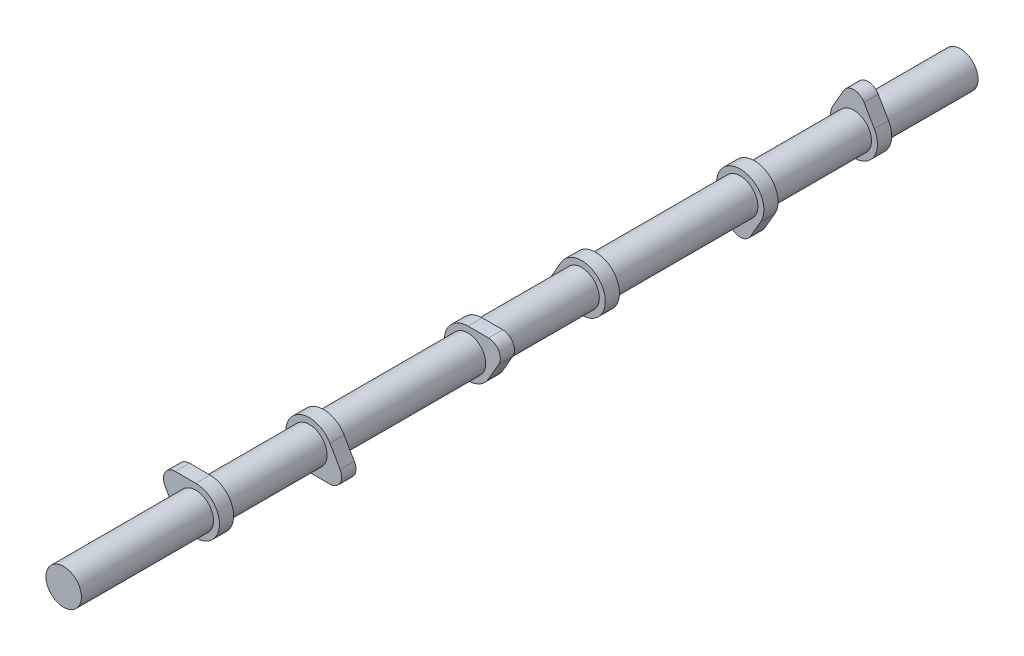
ISO-10303-21;
HEADER;
FILE_DESCRIPTION(('STEP AP214'),'2;1');
FILE_NAME('part.step','',(''),(''),'','','');
FILE_SCHEMA(('AUTOMOTIVE_DESIGN { 1 0 10303 214 1 1 1 1 }'));
ENDSEC;
DATA;
#1=APPLICATION_CONTEXT('core data for automotive mechanical design processes');
#2=APPLICATION_PROTOCOL_DEFINITION('international standard','automotive_design',2000,#1);
#3=PRODUCT_CONTEXT('',#1,'mechanical');
#4=PRODUCT('Part','Part','',(#3));
#5=PRODUCT_RELATED_PRODUCT_CATEGORY('part','',(#4));
#6=PRODUCT_DEFINITION_FORMATION('','',#4);
#7=PRODUCT_DEFINITION_CONTEXT('part definition',#1,'design');
#8=PRODUCT_DEFINITION('design','',#6,#7);
#9=PRODUCT_DEFINITION_SHAPE('','',#8);
#10=(LENGTH_UNIT() NAMED_UNIT(*) SI_UNIT(.MILLI.,.METRE.));
#11=(NAMED_UNIT(*) PLANE_ANGLE_UNIT() SI_UNIT($,.RADIAN.));
#12=(NAMED_UNIT(*) SI_UNIT($,.STERADIAN.) SOLID_ANGLE_UNIT());
#13=UNCERTAINTY_MEASURE_WITH_UNIT(LENGTH_MEASURE(1.E-05),#10,'distance_accuracy_value','');
#14=(GEOMETRIC_REPRESENTATION_CONTEXT(3) GLOBAL_UNCERTAINTY_ASSIGNED_CONTEXT((#13)) GLOBAL_UNIT_ASSIGNED_CONTEXT((#10,
#11,#12)) REPRESENTATION_CONTEXT('',''));
#15=CARTESIAN_POINT('',(0.,0.,0.));
#16=DIRECTION('',(0.,0.,1.));
#17=DIRECTION('',(1.,0.,0.));
#18=AXIS2_PLACEMENT_3D('',#15,#16,#17);
#19=CARTESIAN_POINT('',(0.,-12.7,64.77));
#20=DIRECTION('',(0.,0.,-1.));
#21=DIRECTION('',(1.,0.,0.));
#22=AXIS2_PLACEMENT_3D('',#19,#20,#21);
#23=CYLINDRICAL_SURFACE('',#22,6.35);
#24=CARTESIAN_POINT('',(0.,-12.7,57.15));
#25=DIRECTION('',(0.,0.,1.));
#26=DIRECTION('',(-1.,0.,0.));
#27=AXIS2_PLACEMENT_3D('',#24,#25,#26);
#28=CIRCLE('',#27,6.35);
#29=CARTESIAN_POINT('',(-5.49926131403129,-15.875,57.15));
#30=VERTEX_POINT('',#29);
#31=CARTESIAN_POINT('',(5.49926131403107,-15.875,57.15));
#32=VERTEX_POINT('',#31);
#33=EDGE_CURVE('E389',#30,#32,#28,.T.);
#34=ORIENTED_EDGE('',*,*,#33,.T.);
#35=DIRECTION('',(0.,0.,-1.));
#36=VECTOR('',#35,1.);
#37=CARTESIAN_POINT('',(5.49926131403107,-15.875,64.77));
#38=LINE('',#37,#36);
#39=CARTESIAN_POINT('',(5.49926131403107,-15.875,64.77));
#40=VERTEX_POINT('',#39);
#41=EDGE_CURVE('E408',#40,#32,#38,.T.);
#42=ORIENTED_EDGE('',*,*,#41,.F.);
#43=CARTESIAN_POINT('',(0.,-12.7,64.77));
#44=DIRECTION('',(0.,0.,1.));
#45=DIRECTION('',(-1.,0.,0.));
#46=AXIS2_PLACEMENT_3D('',#43,#44,#45);
#47=CIRCLE('',#46,6.35);
#48=CARTESIAN_POINT('',(-5.49926131403129,-15.875,64.77));
#49=VERTEX_POINT('',#48);
#50=EDGE_CURVE('E390',#49,#40,#47,.T.);
#51=ORIENTED_EDGE('',*,*,#50,.F.);
#52=DIRECTION('',(0.,0.,-1.));
#53=VECTOR('',#52,1.);
#54=CARTESIAN_POINT('',(-5.49926131403129,-15.875,64.77));
#55=LINE('',#54,#53);
#56=EDGE_CURVE('E396',#49,#30,#55,.T.);
#57=ORIENTED_EDGE('',*,*,#56,.T.);
#58=EDGE_LOOP('',(#34,#42,#51,#57));
#59=FACE_BOUND('',#58,.T.);
#60=ADVANCED_FACE('F37',(#59),#23,.T.);
#61=CARTESIAN_POINT('',(5.49926131403107,-15.875,64.77));
#62=DIRECTION('',(-0.866025403784435,0.500000000000006,0.));
#63=DIRECTION('',(-0.500000000000006,-0.866025403784435,0.));
#64=AXIS2_PLACEMENT_3D('',#61,#62,#63);
#65=PLANE('',#64);
#66=DIRECTION('',(0.500000000000006,0.866025403784435,0.));
#67=VECTOR('',#66,1.);
#68=CARTESIAN_POINT('',(5.49926131403107,-15.875,57.15));
#69=LINE('',#68,#67);
#70=CARTESIAN_POINT('',(10.9985226280623,-6.35000000000008,57.15));
#71=VERTEX_POINT('',#70);
#72=EDGE_CURVE('E399',#32,#71,#69,.T.);
#73=ORIENTED_EDGE('',*,*,#72,.T.);
#74=DIRECTION('',(0.,0.,-1.));
#75=VECTOR('',#74,1.);
#76=CARTESIAN_POINT('',(10.9985226280623,-6.35000000000008,64.77));
#77=LINE('',#76,#75);
#78=CARTESIAN_POINT('',(10.9985226280623,-6.35000000000008,64.77));
#79=VERTEX_POINT('',#78);
#80=EDGE_CURVE('E406',#79,#71,#77,.T.);
#81=ORIENTED_EDGE('',*,*,#80,.F.);
#82=DIRECTION('',(0.500000000000006,0.866025403784435,0.));
#83=VECTOR('',#82,1.);
#84=CARTESIAN_POINT('',(5.49926131403107,-15.875,64.77));
#85=LINE('',#84,#83);
#86=EDGE_CURVE('E86',#40,#79,#85,.T.);
#87=ORIENTED_EDGE('',*,*,#86,.F.);
#88=ORIENTED_EDGE('',*,*,#41,.T.);
#89=EDGE_LOOP('',(#73,#81,#87,#88));
#90=FACE_BOUND('',#89,.T.);
#91=ADVANCED_FACE('F427',(#90),#65,.F.);
#92=CARTESIAN_POINT('',(0.,0.,64.77));
#93=DIRECTION('',(0.,0.,-1.));
#94=DIRECTION('',(1.,0.,0.));
#95=AXIS2_PLACEMENT_3D('',#92,#93,#94);
#96=CYLINDRICAL_SURFACE('',#95,12.7);
#97=CARTESIAN_POINT('',(0.,0.,57.15));
#98=DIRECTION('',(0.,0.,1.));
#99=DIRECTION('',(-1.,0.,0.));
#100=AXIS2_PLACEMENT_3D('',#97,#98,#99);
#101=CIRCLE('',#100,12.7);
#102=CARTESIAN_POINT('',(-10.9985226280624,-6.34999999999993,57.15));
#103=VERTEX_POINT('',#102);
#104=EDGE_CURVE('E72',#71,#103,#101,.T.);
#105=ORIENTED_EDGE('',*,*,#104,.T.);
#106=DIRECTION('',(0.,0.,-1.));
#107=VECTOR('',#106,1.);
#108=CARTESIAN_POINT('',(-10.9985226280624,-6.34999999999993,64.77));
#109=LINE('',#108,#107);
#110=CARTESIAN_POINT('',(-10.9985226280624,-6.34999999999993,64.77));
#111=VERTEX_POINT('',#110);
#112=EDGE_CURVE('E404',#111,#103,#109,.T.);
#113=ORIENTED_EDGE('',*,*,#112,.F.);
#114=CARTESIAN_POINT('',(0.,0.,64.77));
#115=DIRECTION('',(0.,0.,1.));
#116=DIRECTION('',(-1.,0.,0.));
#117=AXIS2_PLACEMENT_3D('',#114,#115,#116);
#118=CIRCLE('',#117,12.7);
#119=EDGE_CURVE('E393',#79,#111,#118,.T.);
#120=ORIENTED_EDGE('',*,*,#119,.F.);
#121=ORIENTED_EDGE('',*,*,#80,.T.);
#122=EDGE_LOOP('',(#105,#113,#120,#121));
#123=FACE_BOUND('',#122,.T.);
#124=ADVANCED_FACE('F426',(#123),#96,.T.);
#125=CARTESIAN_POINT('',(-5.49926131403129,-15.875,64.77));
#126=DIRECTION('',(0.866025403784442,0.499999999999994,0.));
#127=DIRECTION('',(-0.499999999999994,0.866025403784442,0.));
#128=AXIS2_PLACEMENT_3D('',#125,#126,#127);
#129=PLANE('',#128);
#130=DIRECTION('',(0.499999999999994,-0.866025403784442,0.));
#131=VECTOR('',#130,1.);
#132=CARTESIAN_POINT('',(-5.49926131403129,-15.875,57.15));
#133=LINE('',#132,#131);
#134=EDGE_CURVE('E78',#103,#30,#133,.T.);
#135=ORIENTED_EDGE('',*,*,#134,.T.);
#136=ORIENTED_EDGE('',*,*,#56,.F.);
#137=DIRECTION('',(0.499999999999994,-0.866025403784442,0.));
#138=VECTOR('',#137,1.);
#139=CARTESIAN_POINT('',(-5.49926131403129,-15.875,64.77));
#140=LINE('',#139,#138);
#141=EDGE_CURVE('E54',#111,#49,#140,.T.);
#142=ORIENTED_EDGE('',*,*,#141,.F.);
#143=ORIENTED_EDGE('',*,*,#112,.T.);
#144=EDGE_LOOP('',(#135,#136,#142,#143));
#145=FACE_BOUND('',#144,.T.);
#146=ADVANCED_FACE('F424',(#145),#129,.F.);
#147=CARTESIAN_POINT('',(0.,-12.7,64.77));
#148=DIRECTION('',(0.,0.,1.));
#149=DIRECTION('',(-1.,0.,0.));
#150=AXIS2_PLACEMENT_3D('',#147,#148,#149);
#151=PLANE('',#150);
#152=CARTESIAN_POINT('',(0.,0.,64.77));
#153=DIRECTION('',(0.,0.,1.));
#154=DIRECTION('',(1.,0.,0.));
#155=AXIS2_PLACEMENT_3D('',#152,#153,#154);
#156=CIRCLE('',#155,9.5);
#157=CARTESIAN_POINT('',(9.5,0.,64.77));
#158=VERTEX_POINT('',#157);
#159=EDGE_CURVE('E386',#158,#158,#156,.F.);
#160=ORIENTED_EDGE('',*,*,#159,.T.);
#161=EDGE_LOOP('',(#160));
#162=FACE_BOUND('',#161,.T.);
#163=ORIENTED_EDGE('',*,*,#50,.T.);
#164=ORIENTED_EDGE('',*,*,#86,.T.);
#165=ORIENTED_EDGE('',*,*,#119,.T.);
#166=ORIENTED_EDGE('',*,*,#141,.T.);
#167=EDGE_LOOP('',(#163,#164,#165,#166));
#168=FACE_BOUND('',#167,.T.);
#169=ADVANCED_FACE('F418',(#162,#168),#151,.T.);
#170=CARTESIAN_POINT('',(0.,-12.7,57.15));
#171=DIRECTION('',(0.,0.,1.));
#172=DIRECTION('',(-1.,0.,0.));
#173=AXIS2_PLACEMENT_3D('',#170,#171,#172);
#174=PLANE('',#173);
#175=CARTESIAN_POINT('',(0.,0.,57.15));
#176=DIRECTION('',(0.,0.,1.));
#177=DIRECTION('',(1.,0.,0.));
#178=AXIS2_PLACEMENT_3D('',#175,#176,#177);
#179=CIRCLE('',#178,9.5);
#180=CARTESIAN_POINT('',(9.5,0.,57.15));
#181=VERTEX_POINT('',#180);
#182=EDGE_CURVE('E46',#181,#181,#179,.F.);
#183=ORIENTED_EDGE('',*,*,#182,.F.);
#184=EDGE_LOOP('',(#183));
#185=FACE_BOUND('',#184,.T.);
#186=ORIENTED_EDGE('',*,*,#33,.F.);
#187=ORIENTED_EDGE('',*,*,#134,.F.);
#188=ORIENTED_EDGE('',*,*,#104,.F.);
#189=ORIENTED_EDGE('',*,*,#72,.F.);
#190=EDGE_LOOP('',(#186,#187,#188,#189));
#191=FACE_BOUND('',#190,.T.);
#192=ADVANCED_FACE('F415',(#185,#191),#174,.F.);
#193=CARTESIAN_POINT('',(0.,0.,120.65));
#194=DIRECTION('',(0.,0.,-1.));
#195=DIRECTION('',(-1.,0.,0.));
#196=AXIS2_PLACEMENT_3D('',#193,#194,#195);
#197=CYLINDRICAL_SURFACE('',#196,9.5);
#198=CARTESIAN_POINT('',(0.,0.,3.80999999999999));
#199=DIRECTION('',(0.,0.,1.));
#200=DIRECTION('',(1.,0.,0.));
#201=AXIS2_PLACEMENT_3D('',#198,#199,#200);
#202=CIRCLE('',#201,9.5);
#203=CARTESIAN_POINT('',(9.5,0.,3.80999999999999));
#204=VERTEX_POINT('',#203);
#205=EDGE_CURVE('E40',#204,#204,#202,.T.);
#206=ORIENTED_EDGE('',*,*,#205,.T.);
#207=EDGE_LOOP('',(#206));
#208=FACE_BOUND('',#207,.T.);
#209=ORIENTED_EDGE('',*,*,#182,.T.);
#210=EDGE_LOOP('',(#209));
#211=FACE_BOUND('',#210,.T.);
#212=ADVANCED_FACE('F413',(#208,#211),#197,.T.);
#213=ORIENTED_EDGE('',*,*,#159,.F.);
#214=EDGE_LOOP('',(#213));
#215=FACE_BOUND('',#214,.T.);
#216=CARTESIAN_POINT('',(0.,0.,142.24));
#217=DIRECTION('',(0.,0.,1.));
#218=DIRECTION('',(-0.500000000000004,0.866025403784436,0.));
#219=AXIS2_PLACEMENT_3D('',#216,#217,#218);
#220=CIRCLE('',#219,9.5);
#221=CARTESIAN_POINT('',(-4.75000000000004,8.22724133595215,142.24));
#222=VERTEX_POINT('',#221);
#223=EDGE_CURVE('E348',#222,#222,#220,.T.);
#224=ORIENTED_EDGE('',*,*,#223,.F.);
#225=EDGE_LOOP('',(#224));
#226=FACE_BOUND('',#225,.T.);
#227=ADVANCED_FACE('F440',(#215,#226),#197,.T.);
#228=CARTESIAN_POINT('',(0.,12.7,3.81));
#229=DIRECTION('',(0.,0.,-1.));
#230=DIRECTION('',(-1.,0.,0.));
#231=AXIS2_PLACEMENT_3D('',#228,#229,#230);
#232=CYLINDRICAL_SURFACE('',#231,6.35);
#233=CARTESIAN_POINT('',(0.,12.7,-3.81));
#234=DIRECTION('',(0.,0.,1.));
#235=DIRECTION('',(1.,0.,0.));
#236=AXIS2_PLACEMENT_3D('',#233,#234,#235);
#237=CIRCLE('',#236,6.35);
#238=CARTESIAN_POINT('',(5.49926131403118,15.875,-3.81));
#239=VERTEX_POINT('',#238);
#240=CARTESIAN_POINT('',(-5.49926131403118,15.875,-3.81));
#241=VERTEX_POINT('',#240);
#242=EDGE_CURVE('E356',#239,#241,#237,.T.);
#243=ORIENTED_EDGE('',*,*,#242,.T.);
#244=DIRECTION('',(0.,0.,-1.));
#245=VECTOR('',#244,1.);
#246=CARTESIAN_POINT('',(-5.49926131403118,15.875,3.81));
#247=LINE('',#246,#245);
#248=CARTESIAN_POINT('',(-5.49926131403118,15.875,3.81));
#249=VERTEX_POINT('',#248);
#250=EDGE_CURVE('E383',#249,#241,#247,.T.);
#251=ORIENTED_EDGE('',*,*,#250,.F.);
#252=CARTESIAN_POINT('',(0.,12.7,3.81));
#253=DIRECTION('',(0.,0.,1.));
#254=DIRECTION('',(1.,0.,0.));
#255=AXIS2_PLACEMENT_3D('',#252,#253,#254);
#256=CIRCLE('',#255,6.35);
#257=CARTESIAN_POINT('',(5.49926131403118,15.875,3.81));
#258=VERTEX_POINT('',#257);
#259=EDGE_CURVE('E357',#258,#249,#256,.T.);
#260=ORIENTED_EDGE('',*,*,#259,.F.);
#261=DIRECTION('',(0.,0.,-1.));
#262=VECTOR('',#261,1.);
#263=CARTESIAN_POINT('',(5.49926131403118,15.875,3.81));
#264=LINE('',#263,#262);
#265=EDGE_CURVE('E367',#258,#239,#264,.T.);
#266=ORIENTED_EDGE('',*,*,#265,.T.);
#267=EDGE_LOOP('',(#243,#251,#260,#266));
#268=FACE_BOUND('',#267,.T.);
#269=ADVANCED_FACE('F443',(#268),#232,.T.);
#270=CARTESIAN_POINT('',(-5.49926131403118,15.875,3.81));
#271=DIRECTION('',(0.866025403784439,-0.5,0.));
#272=DIRECTION('',(0.5,0.866025403784439,0.));
#273=AXIS2_PLACEMENT_3D('',#270,#271,#272);
#274=PLANE('',#273);
#275=DIRECTION('',(-0.5,-0.866025403784439,0.));
#276=VECTOR('',#275,1.);
#277=CARTESIAN_POINT('',(-5.49926131403118,15.875,-3.81));
#278=LINE('',#277,#276);
#279=CARTESIAN_POINT('',(-10.9985226280624,6.35,-3.81));
#280=VERTEX_POINT('',#279);
#281=EDGE_CURVE('E370',#241,#280,#278,.T.);
#282=ORIENTED_EDGE('',*,*,#281,.T.);
#283=DIRECTION('',(0.,0.,-1.));
#284=VECTOR('',#283,1.);
#285=CARTESIAN_POINT('',(-10.9985226280624,6.35,3.81));
#286=LINE('',#285,#284);
#287=CARTESIAN_POINT('',(-10.9985226280624,6.35,3.81));
#288=VERTEX_POINT('',#287);
#289=EDGE_CURVE('E380',#288,#280,#286,.T.);
#290=ORIENTED_EDGE('',*,*,#289,.F.);
#291=DIRECTION('',(-0.5,-0.866025403784439,0.));
#292=VECTOR('',#291,1.);
#293=CARTESIAN_POINT('',(-5.49926131403118,15.875,3.81));
#294=LINE('',#293,#292);
#295=EDGE_CURVE('E360',#249,#288,#294,.T.);
#296=ORIENTED_EDGE('',*,*,#295,.F.);
#297=ORIENTED_EDGE('',*,*,#250,.T.);
#298=EDGE_LOOP('',(#282,#290,#296,#297));
#299=FACE_BOUND('',#298,.T.);
#300=ADVANCED_FACE('F448',(#299),#274,.F.);
#301=CARTESIAN_POINT('',(0.,0.,3.81));
#302=DIRECTION('',(0.,0.,-1.));
#303=DIRECTION('',(-1.,0.,0.));
#304=AXIS2_PLACEMENT_3D('',#301,#302,#303);
#305=CYLINDRICAL_SURFACE('',#304,12.7);
#306=CARTESIAN_POINT('',(0.,0.,-3.81));
#307=DIRECTION('',(0.,0.,1.));
#308=DIRECTION('',(1.,0.,0.));
#309=AXIS2_PLACEMENT_3D('',#306,#307,#308);
#310=CIRCLE('',#309,12.7);
#311=CARTESIAN_POINT('',(10.9985226280624,6.35,-3.81));
#312=VERTEX_POINT('',#311);
#313=EDGE_CURVE('E372',#280,#312,#310,.T.);
#314=ORIENTED_EDGE('',*,*,#313,.T.);
#315=DIRECTION('',(0.,0.,-1.));
#316=VECTOR('',#315,1.);
#317=CARTESIAN_POINT('',(10.9985226280624,6.35,3.81));
#318=LINE('',#317,#316);
#319=CARTESIAN_POINT('',(10.9985226280624,6.35,3.81));
#320=VERTEX_POINT('',#319);
#321=EDGE_CURVE('E377',#320,#312,#318,.T.);
#322=ORIENTED_EDGE('',*,*,#321,.F.);
#323=CARTESIAN_POINT('',(0.,0.,3.81));
#324=DIRECTION('',(0.,0.,1.));
#325=DIRECTION('',(1.,0.,0.));
#326=AXIS2_PLACEMENT_3D('',#323,#324,#325);
#327=CIRCLE('',#326,12.7);
#328=EDGE_CURVE('E363',#288,#320,#327,.T.);
#329=ORIENTED_EDGE('',*,*,#328,.F.);
#330=ORIENTED_EDGE('',*,*,#289,.T.);
#331=EDGE_LOOP('',(#314,#322,#329,#330));
#332=FACE_BOUND('',#331,.T.);
#333=ADVANCED_FACE('F452',(#332),#305,.T.);
#334=CARTESIAN_POINT('',(5.49926131403118,15.875,3.81));
#335=DIRECTION('',(-0.866025403784438,-0.5,0.));
#336=DIRECTION('',(0.5,-0.866025403784439,0.));
#337=AXIS2_PLACEMENT_3D('',#334,#335,#336);
#338=PLANE('',#337);
#339=DIRECTION('',(-0.5,0.866025403784439,0.));
#340=VECTOR('',#339,1.);
#341=CARTESIAN_POINT('',(5.49926131403118,15.875,-3.81));
#342=LINE('',#341,#340);
#343=EDGE_CURVE('E361',#312,#239,#342,.T.);
#344=ORIENTED_EDGE('',*,*,#343,.T.);
#345=ORIENTED_EDGE('',*,*,#265,.F.);
#346=DIRECTION('',(-0.5,0.866025403784439,0.));
#347=VECTOR('',#346,1.);
#348=CARTESIAN_POINT('',(5.49926131403118,15.875,3.81));
#349=LINE('',#348,#347);
#350=EDGE_CURVE('E365',#320,#258,#349,.T.);
#351=ORIENTED_EDGE('',*,*,#350,.F.);
#352=ORIENTED_EDGE('',*,*,#321,.T.);
#353=EDGE_LOOP('',(#344,#345,#351,#352));
#354=FACE_BOUND('',#353,.T.);
#355=ADVANCED_FACE('F456',(#354),#338,.F.);
#356=CARTESIAN_POINT('',(0.,12.7,3.81));
#357=DIRECTION('',(0.,0.,1.));
#358=DIRECTION('',(1.,0.,0.));
#359=AXIS2_PLACEMENT_3D('',#356,#357,#358);
#360=PLANE('',#359);
#361=ORIENTED_EDGE('',*,*,#205,.F.);
#362=EDGE_LOOP('',(#361));
#363=FACE_BOUND('',#362,.T.);
#364=ORIENTED_EDGE('',*,*,#259,.T.);
#365=ORIENTED_EDGE('',*,*,#295,.T.);
#366=ORIENTED_EDGE('',*,*,#328,.T.);
#367=ORIENTED_EDGE('',*,*,#350,.T.);
#368=EDGE_LOOP('',(#364,#365,#366,#367));
#369=FACE_BOUND('',#368,.T.);
#370=ADVANCED_FACE('F460',(#363,#369),#360,.T.);
#371=CARTESIAN_POINT('',(0.,12.7,-3.81));
#372=DIRECTION('',(0.,0.,1.));
#373=DIRECTION('',(1.,0.,0.));
#374=AXIS2_PLACEMENT_3D('',#371,#372,#373);
#375=PLANE('',#374);
#376=CARTESIAN_POINT('',(0.,0.,-3.80999999999999));
#377=DIRECTION('',(0.,0.,1.));
#378=DIRECTION('',(1.,0.,0.));
#379=AXIS2_PLACEMENT_3D('',#376,#377,#378);
#380=CIRCLE('',#379,9.5);
#381=CARTESIAN_POINT('',(9.5,0.,-3.80999999999999));
#382=VERTEX_POINT('',#381);
#383=EDGE_CURVE('E11',#382,#382,#380,.T.);
#384=ORIENTED_EDGE('',*,*,#383,.T.);
#385=EDGE_LOOP('',(#384));
#386=FACE_BOUND('',#385,.T.);
#387=ORIENTED_EDGE('',*,*,#242,.F.);
#388=ORIENTED_EDGE('',*,*,#343,.F.);
#389=ORIENTED_EDGE('',*,*,#313,.F.);
#390=ORIENTED_EDGE('',*,*,#281,.F.);
#391=EDGE_LOOP('',(#387,#388,#389,#390));
#392=FACE_BOUND('',#391,.T.);
#393=ADVANCED_FACE('F462',(#386,#392),#375,.F.);
#394=ORIENTED_EDGE('',*,*,#383,.F.);
#395=EDGE_LOOP('',(#394));
#396=FACE_BOUND('',#395,.T.);
#397=CARTESIAN_POINT('',(0.,0.,-53.34));
#398=DIRECTION('',(0.,0.,-1.));
#399=DIRECTION('',(-1.,0.,0.));
#400=AXIS2_PLACEMENT_3D('',#397,#398,#399);
#401=CIRCLE('',#400,9.5);
#402=CARTESIAN_POINT('',(-9.5,0.,-53.34));
#403=VERTEX_POINT('',#402);
#404=EDGE_CURVE('E351',#403,#403,#401,.T.);
#405=ORIENTED_EDGE('',*,*,#404,.F.);
#406=EDGE_LOOP('',(#405));
#407=FACE_BOUND('',#406,.T.);
#408=ADVANCED_FACE('F445',(#396,#407),#197,.T.);
#409=CARTESIAN_POINT('',(0.,0.,-53.34));
#410=DIRECTION('',(0.,0.,-1.));
#411=DIRECTION('',(-1.,0.,0.));
#412=AXIS2_PLACEMENT_3D('',#409,#410,#411);
#413=PLANE('',#412);
#414=ORIENTED_EDGE('',*,*,#404,.T.);
#415=EDGE_LOOP('',(#414));
#416=FACE_BOUND('',#415,.T.);
#417=ADVANCED_FACE('F469',(#416),#413,.T.);
#418=CARTESIAN_POINT('',(10.9985226280624,6.34999999999998,210.82));
#419=DIRECTION('',(0.,0.,-1.));
#420=DIRECTION('',(-0.499999999999998,0.86602540378444,0.));
#421=AXIS2_PLACEMENT_3D('',#418,#419,#420);
#422=CYLINDRICAL_SURFACE('',#421,6.35);
#423=CARTESIAN_POINT('',(10.9985226280624,6.34999999999998,203.2));
#424=DIRECTION('',(0.,0.,1.));
#425=DIRECTION('',(0.499999999999998,-0.86602540378444,0.));
#426=AXIS2_PLACEMENT_3D('',#423,#424,#425);
#427=CIRCLE('',#426,6.35);
#428=CARTESIAN_POINT('',(16.4977839420936,3.17499999999996,203.2));
#429=VERTEX_POINT('',#428);
#430=CARTESIAN_POINT('',(10.9985226280624,12.7,203.2));
#431=VERTEX_POINT('',#430);
#432=EDGE_CURVE('E315',#429,#431,#427,.T.);
#433=ORIENTED_EDGE('',*,*,#432,.T.);
#434=DIRECTION('',(0.,0.,-1.));
#435=VECTOR('',#434,1.);
#436=CARTESIAN_POINT('',(10.9985226280624,12.7,210.82));
#437=LINE('',#436,#435);
#438=CARTESIAN_POINT('',(10.9985226280624,12.7,210.82));
#439=VERTEX_POINT('',#438);
#440=EDGE_CURVE('E342',#439,#431,#437,.T.);
#441=ORIENTED_EDGE('',*,*,#440,.F.);
#442=CARTESIAN_POINT('',(10.9985226280624,6.34999999999998,210.82));
#443=DIRECTION('',(0.,0.,1.));
#444=DIRECTION('',(0.499999999999998,-0.86602540378444,0.));
#445=AXIS2_PLACEMENT_3D('',#442,#443,#444);
#446=CIRCLE('',#445,6.35);
#447=CARTESIAN_POINT('',(16.4977839420936,3.17499999999996,210.82));
#448=VERTEX_POINT('',#447);
#449=EDGE_CURVE('E316',#448,#439,#446,.T.);
#450=ORIENTED_EDGE('',*,*,#449,.F.);
#451=DIRECTION('',(0.,0.,-1.));
#452=VECTOR('',#451,1.);
#453=CARTESIAN_POINT('',(16.4977839420936,3.17499999999996,210.82));
#454=LINE('',#453,#452);
#455=EDGE_CURVE('E326',#448,#429,#454,.T.);
#456=ORIENTED_EDGE('',*,*,#455,.T.);
#457=EDGE_LOOP('',(#433,#441,#450,#456));
#458=FACE_BOUND('',#457,.T.);
#459=ADVANCED_FACE('F472',(#458),#422,.T.);
#460=CARTESIAN_POINT('',(10.9985226280624,12.7,210.82));
#461=DIRECTION('',(0.,-1.,0.));
#462=DIRECTION('',(1.,0.,0.));
#463=AXIS2_PLACEMENT_3D('',#460,#461,#462);
#464=PLANE('',#463);
#465=DIRECTION('',(-1.,0.,0.));
#466=VECTOR('',#465,1.);
#467=CARTESIAN_POINT('',(10.9985226280624,12.7,203.2));
#468=LINE('',#467,#466);
#469=CARTESIAN_POINT('',(0.,12.7,203.2));
#470=VERTEX_POINT('',#469);
#471=EDGE_CURVE('E329',#431,#470,#468,.T.);
#472=ORIENTED_EDGE('',*,*,#471,.T.);
#473=DIRECTION('',(0.,0.,-1.));
#474=VECTOR('',#473,1.);
#475=CARTESIAN_POINT('',(0.,12.7,210.82));
#476=LINE('',#475,#474);
#477=CARTESIAN_POINT('',(0.,12.7,210.82));
#478=VERTEX_POINT('',#477);
#479=EDGE_CURVE('E339',#478,#470,#476,.T.);
#480=ORIENTED_EDGE('',*,*,#479,.F.);
#481=DIRECTION('',(-1.,0.,0.));
#482=VECTOR('',#481,1.);
#483=CARTESIAN_POINT('',(10.9985226280624,12.7,210.82));
#484=LINE('',#483,#482);
#485=EDGE_CURVE('E319',#439,#478,#484,.T.);
#486=ORIENTED_EDGE('',*,*,#485,.F.);
#487=ORIENTED_EDGE('',*,*,#440,.T.);
#488=EDGE_LOOP('',(#472,#480,#486,#487));
#489=FACE_BOUND('',#488,.T.);
#490=ADVANCED_FACE('F476',(#489),#464,.F.);
#491=CARTESIAN_POINT('',(0.,0.,210.82));
#492=DIRECTION('',(0.,0.,-1.));
#493=DIRECTION('',(-0.499999999999998,0.86602540378444,0.));
#494=AXIS2_PLACEMENT_3D('',#491,#492,#493);
#495=CYLINDRICAL_SURFACE('',#494,12.7);
#496=CARTESIAN_POINT('',(0.,0.,203.2));
#497=DIRECTION('',(0.,0.,1.));
#498=DIRECTION('',(0.499999999999998,-0.86602540378444,0.));
#499=AXIS2_PLACEMENT_3D('',#496,#497,#498);
#500=CIRCLE('',#499,12.7);
#501=CARTESIAN_POINT('',(10.9985226280624,-6.35000000000002,203.2));
#502=VERTEX_POINT('',#501);
#503=EDGE_CURVE('E331',#470,#502,#500,.T.);
#504=ORIENTED_EDGE('',*,*,#503,.T.);
#505=DIRECTION('',(0.,0.,-1.));
#506=VECTOR('',#505,1.);
#507=CARTESIAN_POINT('',(10.9985226280624,-6.35000000000002,210.82));
#508=LINE('',#507,#506);
#509=CARTESIAN_POINT('',(10.9985226280624,-6.35000000000002,210.82));
#510=VERTEX_POINT('',#509);
#511=EDGE_CURVE('E336',#510,#502,#508,.T.);
#512=ORIENTED_EDGE('',*,*,#511,.F.);
#513=CARTESIAN_POINT('',(0.,0.,210.82));
#514=DIRECTION('',(0.,0.,1.));
#515=DIRECTION('',(0.499999999999998,-0.86602540378444,0.));
#516=AXIS2_PLACEMENT_3D('',#513,#514,#515);
#517=CIRCLE('',#516,12.7);
#518=EDGE_CURVE('E322',#478,#510,#517,.T.);
#519=ORIENTED_EDGE('',*,*,#518,.F.);
#520=ORIENTED_EDGE('',*,*,#479,.T.);
#521=EDGE_LOOP('',(#504,#512,#519,#520));
#522=FACE_BOUND('',#521,.T.);
#523=ADVANCED_FACE('F480',(#522),#495,.T.);
#524=CARTESIAN_POINT('',(16.4977839420936,3.17499999999996,210.82));
#525=DIRECTION('',(-0.866025403784438,0.500000000000002,0.));
#526=DIRECTION('',(-0.500000000000002,-0.866025403784438,0.));
#527=AXIS2_PLACEMENT_3D('',#524,#525,#526);
#528=PLANE('',#527);
#529=DIRECTION('',(0.500000000000002,0.866025403784438,0.));
#530=VECTOR('',#529,1.);
#531=CARTESIAN_POINT('',(16.4977839420936,3.17499999999996,203.2));
#532=LINE('',#531,#530);
#533=EDGE_CURVE('E320',#502,#429,#532,.T.);
#534=ORIENTED_EDGE('',*,*,#533,.T.);
#535=ORIENTED_EDGE('',*,*,#455,.F.);
#536=DIRECTION('',(0.500000000000002,0.866025403784438,0.));
#537=VECTOR('',#536,1.);
#538=CARTESIAN_POINT('',(16.4977839420936,3.17499999999996,210.82));
#539=LINE('',#538,#537);
#540=EDGE_CURVE('E324',#510,#448,#539,.T.);
#541=ORIENTED_EDGE('',*,*,#540,.F.);
#542=ORIENTED_EDGE('',*,*,#511,.T.);
#543=EDGE_LOOP('',(#534,#535,#541,#542));
#544=FACE_BOUND('',#543,.T.);
#545=ADVANCED_FACE('F484',(#544),#528,.F.);
#546=CARTESIAN_POINT('',(10.9985226280624,6.34999999999998,210.82));
#547=DIRECTION('',(0.,0.,1.));
#548=DIRECTION('',(0.499999999999998,-0.86602540378444,0.));
#549=AXIS2_PLACEMENT_3D('',#546,#547,#548);
#550=PLANE('',#549);
#551=CARTESIAN_POINT('',(0.,0.,210.82));
#552=DIRECTION('',(0.,0.,1.));
#553=DIRECTION('',(-0.500000000000004,0.866025403784436,0.));
#554=AXIS2_PLACEMENT_3D('',#551,#552,#553);
#555=CIRCLE('',#554,9.5);
#556=CARTESIAN_POINT('',(-4.75000000000004,8.22724133595215,210.82));
#557=VERTEX_POINT('',#556);
#558=EDGE_CURVE('E312',#557,#557,#555,.F.);
#559=ORIENTED_EDGE('',*,*,#558,.T.);
#560=EDGE_LOOP('',(#559));
#561=FACE_BOUND('',#560,.T.);
#562=ORIENTED_EDGE('',*,*,#449,.T.);
#563=ORIENTED_EDGE('',*,*,#485,.T.);
#564=ORIENTED_EDGE('',*,*,#518,.T.);
#565=ORIENTED_EDGE('',*,*,#540,.T.);
#566=EDGE_LOOP('',(#562,#563,#564,#565));
#567=FACE_BOUND('',#566,.T.);
#568=ADVANCED_FACE('F488',(#561,#567),#550,.T.);
#569=CARTESIAN_POINT('',(10.9985226280624,6.34999999999998,203.2));
#570=DIRECTION('',(0.,0.,1.));
#571=DIRECTION('',(0.499999999999998,-0.86602540378444,0.));
#572=AXIS2_PLACEMENT_3D('',#569,#570,#571);
#573=PLANE('',#572);
#574=CARTESIAN_POINT('',(0.,0.,203.2));
#575=DIRECTION('',(0.,0.,1.));
#576=DIRECTION('',(-0.500000000000004,0.866025403784436,0.));
#577=AXIS2_PLACEMENT_3D('',#574,#575,#576);
#578=CIRCLE('',#577,9.5);
#579=CARTESIAN_POINT('',(-4.75000000000004,8.22724133595215,203.2));
#580=VERTEX_POINT('',#579);
#581=EDGE_CURVE('E345',#580,#580,#578,.F.);
#582=ORIENTED_EDGE('',*,*,#581,.F.);
#583=EDGE_LOOP('',(#582));
#584=FACE_BOUND('',#583,.T.);
#585=ORIENTED_EDGE('',*,*,#432,.F.);
#586=ORIENTED_EDGE('',*,*,#533,.F.);
#587=ORIENTED_EDGE('',*,*,#503,.F.);
#588=ORIENTED_EDGE('',*,*,#471,.F.);
#589=EDGE_LOOP('',(#585,#586,#587,#588));
#590=FACE_BOUND('',#589,.T.);
#591=ADVANCED_FACE('F490',(#584,#590),#573,.F.);
#592=CARTESIAN_POINT('',(0.,0.,266.7));
#593=DIRECTION('',(0.,0.,-1.));
#594=DIRECTION('',(0.500000000000004,-0.866025403784436,0.));
#595=AXIS2_PLACEMENT_3D('',#592,#593,#594);
#596=CYLINDRICAL_SURFACE('',#595,9.5);
#597=CARTESIAN_POINT('',(0.,0.,149.86));
#598=DIRECTION('',(0.,0.,1.));
#599=DIRECTION('',(-0.500000000000004,0.866025403784436,0.));
#600=AXIS2_PLACEMENT_3D('',#597,#598,#599);
#601=CIRCLE('',#600,9.5);
#602=CARTESIAN_POINT('',(-4.75000000000004,8.22724133595215,149.86));
#603=VERTEX_POINT('',#602);
#604=EDGE_CURVE('E311',#603,#603,#601,.T.);
#605=ORIENTED_EDGE('',*,*,#604,.T.);
#606=EDGE_LOOP('',(#605));
#607=FACE_BOUND('',#606,.T.);
#608=ORIENTED_EDGE('',*,*,#581,.T.);
#609=EDGE_LOOP('',(#608));
#610=FACE_BOUND('',#609,.T.);
#611=ADVANCED_FACE('F493',(#607,#610),#596,.T.);
#612=ORIENTED_EDGE('',*,*,#558,.F.);
#613=EDGE_LOOP('',(#612));
#614=FACE_BOUND('',#613,.T.);
#615=CARTESIAN_POINT('',(0.,0.,288.29));
#616=DIRECTION('',(0.,0.,1.));
#617=DIRECTION('',(-0.499999999999992,-0.866025403784443,0.));
#618=AXIS2_PLACEMENT_3D('',#615,#616,#617);
#619=CIRCLE('',#618,9.5);
#620=CARTESIAN_POINT('',(-4.74999999999992,-8.22724133595221,288.29));
#621=VERTEX_POINT('',#620);
#622=EDGE_CURVE('E278',#621,#621,#619,.T.);
#623=ORIENTED_EDGE('',*,*,#622,.F.);
#624=EDGE_LOOP('',(#623));
#625=FACE_BOUND('',#624,.T.);
#626=ADVANCED_FACE('F498',(#614,#625),#596,.T.);
#627=CARTESIAN_POINT('',(-10.9985226280623,-6.35000000000005,149.86));
#628=DIRECTION('',(0.,0.,-1.));
#629=DIRECTION('',(0.500000000000004,-0.866025403784436,0.));
#630=AXIS2_PLACEMENT_3D('',#627,#628,#629);
#631=CYLINDRICAL_SURFACE('',#630,6.35);
#632=CARTESIAN_POINT('',(-10.9985226280623,-6.35000000000005,142.24));
#633=DIRECTION('',(0.,0.,1.));
#634=DIRECTION('',(-0.500000000000004,0.866025403784436,0.));
#635=AXIS2_PLACEMENT_3D('',#632,#633,#634);
#636=CIRCLE('',#635,6.35);
#637=CARTESIAN_POINT('',(-16.4977839420935,-3.17500000000008,142.24));
#638=VERTEX_POINT('',#637);
#639=CARTESIAN_POINT('',(-10.9985226280623,-12.7000000000001,142.24));
#640=VERTEX_POINT('',#639);
#641=EDGE_CURVE('E280',#638,#640,#636,.T.);
#642=ORIENTED_EDGE('',*,*,#641,.T.);
#643=DIRECTION('',(0.,0.,-1.));
#644=VECTOR('',#643,1.);
#645=CARTESIAN_POINT('',(-10.9985226280623,-12.7000000000001,149.86));
#646=LINE('',#645,#644);
#647=CARTESIAN_POINT('',(-10.9985226280623,-12.7000000000001,149.86));
#648=VERTEX_POINT('',#647);
#649=EDGE_CURVE('E308',#648,#640,#646,.T.);
#650=ORIENTED_EDGE('',*,*,#649,.F.);
#651=CARTESIAN_POINT('',(-10.9985226280623,-6.35000000000005,149.86));
#652=DIRECTION('',(0.,0.,1.));
#653=DIRECTION('',(-0.500000000000004,0.866025403784436,0.));
#654=AXIS2_PLACEMENT_3D('',#651,#652,#653);
#655=CIRCLE('',#654,6.35);
#656=CARTESIAN_POINT('',(-16.4977839420935,-3.17500000000008,149.86));
#657=VERTEX_POINT('',#656);
#658=EDGE_CURVE('E282',#657,#648,#655,.T.);
#659=ORIENTED_EDGE('',*,*,#658,.F.);
#660=DIRECTION('',(0.,0.,-1.));
#661=VECTOR('',#660,1.);
#662=CARTESIAN_POINT('',(-16.4977839420935,-3.17500000000008,149.86));
#663=LINE('',#662,#661);
#664=EDGE_CURVE('E292',#657,#638,#663,.T.);
#665=ORIENTED_EDGE('',*,*,#664,.T.);
#666=EDGE_LOOP('',(#642,#650,#659,#665));
#667=FACE_BOUND('',#666,.T.);
#668=ADVANCED_FACE('F501',(#667),#631,.T.);
#669=CARTESIAN_POINT('',(-10.9985226280623,-12.7000000000001,149.86));
#670=DIRECTION('',(0.,1.,0.));
#671=DIRECTION('',(-1.,0.,0.));
#672=AXIS2_PLACEMENT_3D('',#669,#670,#671);
#673=PLANE('',#672);
#674=DIRECTION('',(1.,0.,0.));
#675=VECTOR('',#674,1.);
#676=CARTESIAN_POINT('',(-10.9985226280623,-12.7000000000001,142.24));
#677=LINE('',#676,#675);
#678=CARTESIAN_POINT('',(0.,-12.7,142.24));
#679=VERTEX_POINT('',#678);
#680=EDGE_CURVE('E295',#640,#679,#677,.T.);
#681=ORIENTED_EDGE('',*,*,#680,.T.);
#682=DIRECTION('',(0.,0.,-1.));
#683=VECTOR('',#682,1.);
#684=CARTESIAN_POINT('',(0.,-12.7,149.86));
#685=LINE('',#684,#683);
#686=CARTESIAN_POINT('',(0.,-12.7,149.86));
#687=VERTEX_POINT('',#686);
#688=EDGE_CURVE('E305',#687,#679,#685,.T.);
#689=ORIENTED_EDGE('',*,*,#688,.F.);
#690=DIRECTION('',(1.,0.,0.));
#691=VECTOR('',#690,1.);
#692=CARTESIAN_POINT('',(-10.9985226280623,-12.7000000000001,149.86));
#693=LINE('',#692,#691);
#694=EDGE_CURVE('E285',#648,#687,#693,.T.);
#695=ORIENTED_EDGE('',*,*,#694,.F.);
#696=ORIENTED_EDGE('',*,*,#649,.T.);
#697=EDGE_LOOP('',(#681,#689,#695,#696));
#698=FACE_BOUND('',#697,.T.);
#699=ADVANCED_FACE('F505',(#698),#673,.F.);
#700=CARTESIAN_POINT('',(0.,0.,149.86));
#701=DIRECTION('',(0.,0.,-1.));
#702=DIRECTION('',(0.500000000000004,-0.866025403784436,0.));
#703=AXIS2_PLACEMENT_3D('',#700,#701,#702);
#704=CYLINDRICAL_SURFACE('',#703,12.7);
#705=CARTESIAN_POINT('',(0.,0.,142.24));
#706=DIRECTION('',(0.,0.,1.));
#707=DIRECTION('',(-0.500000000000004,0.866025403784436,0.));
#708=AXIS2_PLACEMENT_3D('',#705,#706,#707);
#709=CIRCLE('',#708,12.7);
#710=CARTESIAN_POINT('',(-10.9985226280624,6.34999999999995,142.24));
#711=VERTEX_POINT('',#710);
#712=EDGE_CURVE('E297',#679,#711,#709,.T.);
#713=ORIENTED_EDGE('',*,*,#712,.T.);
#714=DIRECTION('',(0.,0.,-1.));
#715=VECTOR('',#714,1.);
#716=CARTESIAN_POINT('',(-10.9985226280624,6.34999999999995,149.86));
#717=LINE('',#716,#715);
#718=CARTESIAN_POINT('',(-10.9985226280624,6.34999999999995,149.86));
#719=VERTEX_POINT('',#718);
#720=EDGE_CURVE('E302',#719,#711,#717,.T.);
#721=ORIENTED_EDGE('',*,*,#720,.F.);
#722=CARTESIAN_POINT('',(0.,0.,149.86));
#723=DIRECTION('',(0.,0.,1.));
#724=DIRECTION('',(-0.500000000000004,0.866025403784436,0.));
#725=AXIS2_PLACEMENT_3D('',#722,#723,#724);
#726=CIRCLE('',#725,12.7);
#727=EDGE_CURVE('E288',#687,#719,#726,.T.);
#728=ORIENTED_EDGE('',*,*,#727,.F.);
#729=ORIENTED_EDGE('',*,*,#688,.T.);
#730=EDGE_LOOP('',(#713,#721,#728,#729));
#731=FACE_BOUND('',#730,.T.);
#732=ADVANCED_FACE('F509',(#731),#704,.T.);
#733=CARTESIAN_POINT('',(-16.4977839420935,-3.17500000000008,149.86));
#734=DIRECTION('',(0.866025403784441,-0.499999999999996,0.));
#735=DIRECTION('',(0.499999999999996,0.866025403784441,0.));
#736=AXIS2_PLACEMENT_3D('',#733,#734,#735);
#737=PLANE('',#736);
#738=DIRECTION('',(-0.499999999999996,-0.866025403784441,0.));
#739=VECTOR('',#738,1.);
#740=CARTESIAN_POINT('',(-16.4977839420935,-3.17500000000008,142.24));
#741=LINE('',#740,#739);
#742=EDGE_CURVE('E286',#711,#638,#741,.T.);
#743=ORIENTED_EDGE('',*,*,#742,.T.);
#744=ORIENTED_EDGE('',*,*,#664,.F.);
#745=DIRECTION('',(-0.499999999999996,-0.866025403784441,0.));
#746=VECTOR('',#745,1.);
#747=CARTESIAN_POINT('',(-16.4977839420935,-3.17500000000008,149.86));
#748=LINE('',#747,#746);
#749=EDGE_CURVE('E290',#719,#657,#748,.T.);
#750=ORIENTED_EDGE('',*,*,#749,.F.);
#751=ORIENTED_EDGE('',*,*,#720,.T.);
#752=EDGE_LOOP('',(#743,#744,#750,#751));
#753=FACE_BOUND('',#752,.T.);
#754=ADVANCED_FACE('F513',(#753),#737,.F.);
#755=CARTESIAN_POINT('',(-10.9985226280623,-6.35000000000005,149.86));
#756=DIRECTION('',(0.,0.,1.));
#757=DIRECTION('',(-0.500000000000004,0.866025403784436,0.));
#758=AXIS2_PLACEMENT_3D('',#755,#756,#757);
#759=PLANE('',#758);
#760=ORIENTED_EDGE('',*,*,#604,.F.);
#761=EDGE_LOOP('',(#760));
#762=FACE_BOUND('',#761,.T.);
#763=ORIENTED_EDGE('',*,*,#658,.T.);
#764=ORIENTED_EDGE('',*,*,#694,.T.);
#765=ORIENTED_EDGE('',*,*,#727,.T.);
#766=ORIENTED_EDGE('',*,*,#749,.T.);
#767=EDGE_LOOP('',(#763,#764,#765,#766));
#768=FACE_BOUND('',#767,.T.);
#769=ADVANCED_FACE('F517',(#762,#768),#759,.T.);
#770=CARTESIAN_POINT('',(-10.9985226280623,-6.35000000000005,142.24));
#771=DIRECTION('',(0.,0.,1.));
#772=DIRECTION('',(-0.500000000000004,0.866025403784436,0.));
#773=AXIS2_PLACEMENT_3D('',#770,#771,#772);
#774=PLANE('',#773);
#775=ORIENTED_EDGE('',*,*,#223,.T.);
#776=EDGE_LOOP('',(#775));
#777=FACE_BOUND('',#776,.T.);
#778=ORIENTED_EDGE('',*,*,#641,.F.);
#779=ORIENTED_EDGE('',*,*,#742,.F.);
#780=ORIENTED_EDGE('',*,*,#712,.F.);
#781=ORIENTED_EDGE('',*,*,#680,.F.);
#782=EDGE_LOOP('',(#778,#779,#780,#781));
#783=FACE_BOUND('',#782,.T.);
#784=ADVANCED_FACE('F519',(#777,#783),#774,.F.);
#785=CARTESIAN_POINT('',(-10.9985226280624,6.34999999999998,356.87));
#786=DIRECTION('',(0.,0.,-1.));
#787=DIRECTION('',(-0.499999999999998,-0.86602540378444,0.));
#788=AXIS2_PLACEMENT_3D('',#785,#786,#787);
#789=CYLINDRICAL_SURFACE('',#788,6.35);
#790=CARTESIAN_POINT('',(-10.9985226280624,6.34999999999998,349.25));
#791=DIRECTION('',(0.,0.,1.));
#792=DIRECTION('',(0.499999999999998,0.86602540378444,0.));
#793=AXIS2_PLACEMENT_3D('',#790,#791,#792);
#794=CIRCLE('',#793,6.35);
#795=CARTESIAN_POINT('',(-10.9985226280624,12.7,349.25));
#796=VERTEX_POINT('',#795);
#797=CARTESIAN_POINT('',(-16.4977839420936,3.17499999999996,349.25));
#798=VERTEX_POINT('',#797);
#799=EDGE_CURVE('E245',#796,#798,#794,.T.);
#800=ORIENTED_EDGE('',*,*,#799,.T.);
#801=DIRECTION('',(0.,0.,-1.));
#802=VECTOR('',#801,1.);
#803=CARTESIAN_POINT('',(-16.4977839420936,3.17499999999996,356.87));
#804=LINE('',#803,#802);
#805=CARTESIAN_POINT('',(-16.4977839420936,3.17499999999996,356.87));
#806=VERTEX_POINT('',#805);
#807=EDGE_CURVE('E272',#806,#798,#804,.T.);
#808=ORIENTED_EDGE('',*,*,#807,.F.);
#809=CARTESIAN_POINT('',(-10.9985226280624,6.34999999999998,356.87));
#810=DIRECTION('',(0.,0.,1.));
#811=DIRECTION('',(0.499999999999998,0.86602540378444,0.));
#812=AXIS2_PLACEMENT_3D('',#809,#810,#811);
#813=CIRCLE('',#812,6.35);
#814=CARTESIAN_POINT('',(-10.9985226280624,12.7,356.87));
#815=VERTEX_POINT('',#814);
#816=EDGE_CURVE('E246',#815,#806,#813,.T.);
#817=ORIENTED_EDGE('',*,*,#816,.F.);
#818=DIRECTION('',(0.,0.,-1.));
#819=VECTOR('',#818,1.);
#820=CARTESIAN_POINT('',(-10.9985226280624,12.7,356.87));
#821=LINE('',#820,#819);
#822=EDGE_CURVE('E256',#815,#796,#821,.T.);
#823=ORIENTED_EDGE('',*,*,#822,.T.);
#824=EDGE_LOOP('',(#800,#808,#817,#823));
#825=FACE_BOUND('',#824,.T.);
#826=ADVANCED_FACE('F522',(#825),#789,.T.);
#827=CARTESIAN_POINT('',(-16.4977839420936,3.17499999999996,356.87));
#828=DIRECTION('',(0.866025403784437,0.500000000000002,0.));
#829=DIRECTION('',(-0.500000000000002,0.866025403784437,0.));
#830=AXIS2_PLACEMENT_3D('',#827,#828,#829);
#831=PLANE('',#830);
#832=DIRECTION('',(0.500000000000002,-0.866025403784437,0.));
#833=VECTOR('',#832,1.);
#834=CARTESIAN_POINT('',(-16.4977839420936,3.17499999999996,349.25));
#835=LINE('',#834,#833);
#836=CARTESIAN_POINT('',(-10.9985226280624,-6.35000000000002,349.25));
#837=VERTEX_POINT('',#836);
#838=EDGE_CURVE('E259',#798,#837,#835,.T.);
#839=ORIENTED_EDGE('',*,*,#838,.T.);
#840=DIRECTION('',(0.,0.,-1.));
#841=VECTOR('',#840,1.);
#842=CARTESIAN_POINT('',(-10.9985226280624,-6.35000000000002,356.87));
#843=LINE('',#842,#841);
#844=CARTESIAN_POINT('',(-10.9985226280624,-6.35000000000002,356.87));
#845=VERTEX_POINT('',#844);
#846=EDGE_CURVE('E269',#845,#837,#843,.T.);
#847=ORIENTED_EDGE('',*,*,#846,.F.);
#848=DIRECTION('',(0.500000000000002,-0.866025403784437,0.));
#849=VECTOR('',#848,1.);
#850=CARTESIAN_POINT('',(-16.4977839420936,3.17499999999996,356.87));
#851=LINE('',#850,#849);
#852=EDGE_CURVE('E249',#806,#845,#851,.T.);
#853=ORIENTED_EDGE('',*,*,#852,.F.);
#854=ORIENTED_EDGE('',*,*,#807,.T.);
#855=EDGE_LOOP('',(#839,#847,#853,#854));
#856=FACE_BOUND('',#855,.T.);
#857=ADVANCED_FACE('F529',(#856),#831,.F.);
#858=CARTESIAN_POINT('',(0.,0.,356.87));
#859=DIRECTION('',(0.,0.,-1.));
#860=DIRECTION('',(-0.499999999999998,-0.86602540378444,0.));
#861=AXIS2_PLACEMENT_3D('',#858,#859,#860);
#862=CYLINDRICAL_SURFACE('',#861,12.7);
#863=CARTESIAN_POINT('',(0.,0.,349.25));
#864=DIRECTION('',(0.,0.,1.));
#865=DIRECTION('',(0.499999999999998,0.86602540378444,0.));
#866=AXIS2_PLACEMENT_3D('',#863,#864,#865);
#867=CIRCLE('',#866,12.7);
#868=CARTESIAN_POINT('',(0.,12.7,349.25));
#869=VERTEX_POINT('',#868);
#870=EDGE_CURVE('E261',#837,#869,#867,.T.);
#871=ORIENTED_EDGE('',*,*,#870,.T.);
#872=DIRECTION('',(0.,0.,-1.));
#873=VECTOR('',#872,1.);
#874=CARTESIAN_POINT('',(0.,12.7,356.87));
#875=LINE('',#874,#873);
#876=CARTESIAN_POINT('',(0.,12.7,356.87));
#877=VERTEX_POINT('',#876);
#878=EDGE_CURVE('E266',#877,#869,#875,.T.);
#879=ORIENTED_EDGE('',*,*,#878,.F.);
#880=CARTESIAN_POINT('',(0.,0.,356.87));
#881=DIRECTION('',(0.,0.,1.));
#882=DIRECTION('',(0.499999999999998,0.86602540378444,0.));
#883=AXIS2_PLACEMENT_3D('',#880,#881,#882);
#884=CIRCLE('',#883,12.7);
#885=EDGE_CURVE('E252',#845,#877,#884,.T.);
#886=ORIENTED_EDGE('',*,*,#885,.F.);
#887=ORIENTED_EDGE('',*,*,#846,.T.);
#888=EDGE_LOOP('',(#871,#879,#886,#887));
#889=FACE_BOUND('',#888,.T.);
#890=ADVANCED_FACE('F533',(#889),#862,.T.);
#891=CARTESIAN_POINT('',(-10.9985226280624,12.7,356.87));
#892=DIRECTION('',(0.,-1.,0.));
#893=DIRECTION('',(1.,0.,0.));
#894=AXIS2_PLACEMENT_3D('',#891,#892,#893);
#895=PLANE('',#894);
#896=DIRECTION('',(-1.,0.,0.));
#897=VECTOR('',#896,1.);
#898=CARTESIAN_POINT('',(-10.9985226280624,12.7,349.25));
#899=LINE('',#898,#897);
#900=EDGE_CURVE('E250',#869,#796,#899,.T.);
#901=ORIENTED_EDGE('',*,*,#900,.T.);
#902=ORIENTED_EDGE('',*,*,#822,.F.);
#903=DIRECTION('',(-1.,0.,0.));
#904=VECTOR('',#903,1.);
#905=CARTESIAN_POINT('',(-10.9985226280624,12.7,356.87));
#906=LINE('',#905,#904);
#907=EDGE_CURVE('E254',#877,#815,#906,.T.);
#908=ORIENTED_EDGE('',*,*,#907,.F.);
#909=ORIENTED_EDGE('',*,*,#878,.T.);
#910=EDGE_LOOP('',(#901,#902,#908,#909));
#911=FACE_BOUND('',#910,.T.);
#912=ADVANCED_FACE('F537',(#911),#895,.F.);
#913=CARTESIAN_POINT('',(-10.9985226280624,6.34999999999998,356.87));
#914=DIRECTION('',(0.,0.,1.));
#915=DIRECTION('',(0.499999999999998,0.86602540378444,0.));
#916=AXIS2_PLACEMENT_3D('',#913,#914,#915);
#917=PLANE('',#916);
#918=CARTESIAN_POINT('',(0.,0.,356.87));
#919=DIRECTION('',(0.,0.,1.));
#920=DIRECTION('',(-0.499999999999992,-0.866025403784443,0.));
#921=AXIS2_PLACEMENT_3D('',#918,#919,#920);
#922=CIRCLE('',#921,9.5);
#923=CARTESIAN_POINT('',(-4.74999999999992,-8.22724133595221,356.87));
#924=VERTEX_POINT('',#923);
#925=EDGE_CURVE('E237',#924,#924,#922,.F.);
#926=ORIENTED_EDGE('',*,*,#925,.T.);
#927=EDGE_LOOP('',(#926));
#928=FACE_BOUND('',#927,.T.);
#929=ORIENTED_EDGE('',*,*,#816,.T.);
#930=ORIENTED_EDGE('',*,*,#852,.T.);
#931=ORIENTED_EDGE('',*,*,#885,.T.);
#932=ORIENTED_EDGE('',*,*,#907,.T.);
#933=EDGE_LOOP('',(#929,#930,#931,#932));
#934=FACE_BOUND('',#933,.T.);
#935=ADVANCED_FACE('F541',(#928,#934),#917,.T.);
#936=CARTESIAN_POINT('',(-10.9985226280624,6.34999999999998,349.25));
#937=DIRECTION('',(0.,0.,1.));
#938=DIRECTION('',(0.499999999999998,0.86602540378444,0.));
#939=AXIS2_PLACEMENT_3D('',#936,#937,#938);
#940=PLANE('',#939);
#941=CARTESIAN_POINT('',(0.,0.,349.25));
#942=DIRECTION('',(0.,0.,1.));
#943=DIRECTION('',(-0.499999999999992,-0.866025403784443,0.));
#944=AXIS2_PLACEMENT_3D('',#941,#942,#943);
#945=CIRCLE('',#944,9.5);
#946=CARTESIAN_POINT('',(-4.74999999999992,-8.22724133595221,349.25));
#947=VERTEX_POINT('',#946);
#948=EDGE_CURVE('E275',#947,#947,#945,.F.);
#949=ORIENTED_EDGE('',*,*,#948,.F.);
#950=EDGE_LOOP('',(#949));
#951=FACE_BOUND('',#950,.T.);
#952=ORIENTED_EDGE('',*,*,#799,.F.);
#953=ORIENTED_EDGE('',*,*,#900,.F.);
#954=ORIENTED_EDGE('',*,*,#870,.F.);
#955=ORIENTED_EDGE('',*,*,#838,.F.);
#956=EDGE_LOOP('',(#952,#953,#954,#955));
#957=FACE_BOUND('',#956,.T.);
#958=ADVANCED_FACE('F543',(#951,#957),#940,.F.);
#959=CARTESIAN_POINT('',(0.,0.,412.75));
#960=DIRECTION('',(0.,0.,-1.));
#961=DIRECTION('',(0.499999999999992,0.866025403784443,0.));
#962=AXIS2_PLACEMENT_3D('',#959,#960,#961);
#963=CYLINDRICAL_SURFACE('',#962,9.5);
#964=CARTESIAN_POINT('',(0.,0.,295.91));
#965=DIRECTION('',(0.,0.,1.));
#966=DIRECTION('',(-0.499999999999992,-0.866025403784443,0.));
#967=AXIS2_PLACEMENT_3D('',#964,#965,#966);
#968=CIRCLE('',#967,9.5);
#969=CARTESIAN_POINT('',(-4.74999999999992,-8.22724133595221,295.91));
#970=VERTEX_POINT('',#969);
#971=EDGE_CURVE('E234',#970,#970,#968,.T.);
#972=ORIENTED_EDGE('',*,*,#971,.T.);
#973=EDGE_LOOP('',(#972));
#974=FACE_BOUND('',#973,.T.);
#975=ORIENTED_EDGE('',*,*,#948,.T.);
#976=EDGE_LOOP('',(#975));
#977=FACE_BOUND('',#976,.T.);
#978=ADVANCED_FACE('F546',(#974,#977),#963,.T.);
#979=ORIENTED_EDGE('',*,*,#925,.F.);
#980=EDGE_LOOP('',(#979));
#981=FACE_BOUND('',#980,.T.);
#982=CARTESIAN_POINT('',(0.,0.,427.75));
#983=DIRECTION('',(0.,0.,1.));
#984=DIRECTION('',(1.,0.,0.));
#985=AXIS2_PLACEMENT_3D('',#982,#983,#984);
#986=CIRCLE('',#985,9.5);
#987=CARTESIAN_POINT('',(9.5,0.,427.75));
#988=VERTEX_POINT('',#987);
#989=EDGE_CURVE('E581',#988,#988,#986,.T.);
#990=ORIENTED_EDGE('',*,*,#989,.F.);
#991=EDGE_LOOP('',(#990));
#992=FACE_BOUND('',#991,.T.);
#993=ADVANCED_FACE('F551',(#981,#992),#963,.T.);
#994=CARTESIAN_POINT('',(10.9985226280624,-6.3499999999999,295.91));
#995=DIRECTION('',(0.,0.,-1.));
#996=DIRECTION('',(0.499999999999992,0.866025403784443,0.));
#997=AXIS2_PLACEMENT_3D('',#994,#995,#996);
#998=CYLINDRICAL_SURFACE('',#997,6.35);
#999=CARTESIAN_POINT('',(10.9985226280624,-6.3499999999999,288.29));
#1000=DIRECTION('',(0.,0.,1.));
#1001=DIRECTION('',(-0.499999999999992,-0.866025403784443,0.));
#1002=AXIS2_PLACEMENT_3D('',#999,#1000,#1001);
#1003=CIRCLE('',#1002,6.35);
#1004=CARTESIAN_POINT('',(10.9985226280625,-12.6999999999999,288.29));
#1005=VERTEX_POINT('',#1004);
#1006=CARTESIAN_POINT('',(16.4977839420936,-3.17499999999985,288.29));
#1007=VERTEX_POINT('',#1006);
#1008=EDGE_CURVE('E233',#1005,#1007,#1003,.T.);
#1009=ORIENTED_EDGE('',*,*,#1008,.T.);
#1010=DIRECTION('',(0.,0.,-1.));
#1011=VECTOR('',#1010,1.);
#1012=CARTESIAN_POINT('',(16.4977839420936,-3.17499999999985,295.91));
#1013=LINE('',#1012,#1011);
#1014=CARTESIAN_POINT('',(16.4977839420936,-3.17499999999985,295.91));
#1015=VERTEX_POINT('',#1014);
#1016=EDGE_CURVE('E213',#1015,#1007,#1013,.T.);
#1017=ORIENTED_EDGE('',*,*,#1016,.F.);
#1018=CARTESIAN_POINT('',(10.9985226280624,-6.3499999999999,295.91));
#1019=DIRECTION('',(0.,0.,1.));
#1020=DIRECTION('',(-0.499999999999992,-0.866025403784443,0.));
#1021=AXIS2_PLACEMENT_3D('',#1018,#1019,#1020);
#1022=CIRCLE('',#1021,6.35);
#1023=CARTESIAN_POINT('',(10.9985226280625,-12.6999999999999,295.91));
#1024=VERTEX_POINT('',#1023);
#1025=EDGE_CURVE('E220',#1024,#1015,#1022,.T.);
#1026=ORIENTED_EDGE('',*,*,#1025,.F.);
#1027=DIRECTION('',(0.,0.,-1.));
#1028=VECTOR('',#1027,1.);
#1029=CARTESIAN_POINT('',(10.9985226280625,-12.6999999999999,295.91));
#1030=LINE('',#1029,#1028);
#1031=EDGE_CURVE('E588',#1024,#1005,#1030,.T.);
#1032=ORIENTED_EDGE('',*,*,#1031,.T.);
#1033=EDGE_LOOP('',(#1009,#1017,#1026,#1032));
#1034=FACE_BOUND('',#1033,.T.);
#1035=ADVANCED_FACE('F231',(#1034),#998,.T.);
#1036=CARTESIAN_POINT('',(16.4977839420936,-3.17499999999985,295.91));
#1037=DIRECTION('',(-0.866025403784434,-0.500000000000008,0.));
#1038=DIRECTION('',(0.500000000000008,-0.866025403784434,0.));
#1039=AXIS2_PLACEMENT_3D('',#1036,#1037,#1038);
#1040=PLANE('',#1039);
#1041=DIRECTION('',(-0.500000000000008,0.866025403784434,0.));
#1042=VECTOR('',#1041,1.);
#1043=CARTESIAN_POINT('',(16.4977839420936,-3.17499999999985,288.29));
#1044=LINE('',#1043,#1042);
#1045=CARTESIAN_POINT('',(10.9985226280623,6.3500000000001,288.29));
#1046=VERTEX_POINT('',#1045);
#1047=EDGE_CURVE('E584',#1007,#1046,#1044,.T.);
#1048=ORIENTED_EDGE('',*,*,#1047,.T.);
#1049=DIRECTION('',(0.,0.,-1.));
#1050=VECTOR('',#1049,1.);
#1051=CARTESIAN_POINT('',(10.9985226280623,6.3500000000001,295.91));
#1052=LINE('',#1051,#1050);
#1053=CARTESIAN_POINT('',(10.9985226280623,6.3500000000001,295.91));
#1054=VERTEX_POINT('',#1053);
#1055=EDGE_CURVE('E216',#1054,#1046,#1052,.T.);
#1056=ORIENTED_EDGE('',*,*,#1055,.F.);
#1057=DIRECTION('',(-0.500000000000008,0.866025403784434,0.));
#1058=VECTOR('',#1057,1.);
#1059=CARTESIAN_POINT('',(16.4977839420936,-3.17499999999985,295.91));
#1060=LINE('',#1059,#1058);
#1061=EDGE_CURVE('E209',#1015,#1054,#1060,.T.);
#1062=ORIENTED_EDGE('',*,*,#1061,.F.);
#1063=ORIENTED_EDGE('',*,*,#1016,.T.);
#1064=EDGE_LOOP('',(#1048,#1056,#1062,#1063));
#1065=FACE_BOUND('',#1064,.T.);
#1066=ADVANCED_FACE('F211',(#1065),#1040,.F.);
#1067=CARTESIAN_POINT('',(0.,0.,295.91));
#1068=DIRECTION('',(0.,0.,-1.));
#1069=DIRECTION('',(0.499999999999992,0.866025403784443,0.));
#1070=AXIS2_PLACEMENT_3D('',#1067,#1068,#1069);
#1071=CYLINDRICAL_SURFACE('',#1070,12.7);
#1072=CARTESIAN_POINT('',(0.,0.,288.29));
#1073=DIRECTION('',(0.,0.,1.));
#1074=DIRECTION('',(-0.499999999999992,-0.866025403784443,0.));
#1075=AXIS2_PLACEMENT_3D('',#1072,#1073,#1074);
#1076=CIRCLE('',#1075,12.7);
#1077=CARTESIAN_POINT('',(1.21430643318376E-13,-12.7,288.29));
#1078=VERTEX_POINT('',#1077);
#1079=EDGE_CURVE('E591',#1046,#1078,#1076,.T.);
#1080=ORIENTED_EDGE('',*,*,#1079,.T.);
#1081=DIRECTION('',(0.,0.,-1.));
#1082=VECTOR('',#1081,1.);
#1083=CARTESIAN_POINT('',(1.21430643318376E-13,-12.7,295.91));
#1084=LINE('',#1083,#1082);
#1085=CARTESIAN_POINT('',(1.21430643318376E-13,-12.7,295.91));
#1086=VERTEX_POINT('',#1085);
#1087=EDGE_CURVE('E239',#1086,#1078,#1084,.T.);
#1088=ORIENTED_EDGE('',*,*,#1087,.F.);
#1089=CARTESIAN_POINT('',(0.,0.,295.91));
#1090=DIRECTION('',(0.,0.,1.));
#1091=DIRECTION('',(-0.499999999999992,-0.866025403784443,0.));
#1092=AXIS2_PLACEMENT_3D('',#1089,#1090,#1091);
#1093=CIRCLE('',#1092,12.7);
#1094=EDGE_CURVE('E219',#1054,#1086,#1093,.T.);
#1095=ORIENTED_EDGE('',*,*,#1094,.F.);
#1096=ORIENTED_EDGE('',*,*,#1055,.T.);
#1097=EDGE_LOOP('',(#1080,#1088,#1095,#1096));
#1098=FACE_BOUND('',#1097,.T.);
#1099=ADVANCED_FACE('F559',(#1098),#1071,.T.);
#1100=CARTESIAN_POINT('',(10.9985226280625,-12.6999999999999,295.91));
#1101=DIRECTION('',(0.,1.,0.));
#1102=DIRECTION('',(-1.,0.,0.));
#1103=AXIS2_PLACEMENT_3D('',#1100,#1101,#1102);
#1104=PLANE('',#1103);
#1105=DIRECTION('',(1.,0.,0.));
#1106=VECTOR('',#1105,1.);
#1107=CARTESIAN_POINT('',(10.9985226280625,-12.6999999999999,288.29));
#1108=LINE('',#1107,#1106);
#1109=EDGE_CURVE('E229',#1078,#1005,#1108,.T.);
#1110=ORIENTED_EDGE('',*,*,#1109,.T.);
#1111=ORIENTED_EDGE('',*,*,#1031,.F.);
#1112=DIRECTION('',(1.,0.,0.));
#1113=VECTOR('',#1112,1.);
#1114=CARTESIAN_POINT('',(10.9985226280625,-12.6999999999999,295.91));
#1115=LINE('',#1114,#1113);
#1116=EDGE_CURVE('E225',#1086,#1024,#1115,.T.);
#1117=ORIENTED_EDGE('',*,*,#1116,.F.);
#1118=ORIENTED_EDGE('',*,*,#1087,.T.);
#1119=EDGE_LOOP('',(#1110,#1111,#1117,#1118));
#1120=FACE_BOUND('',#1119,.T.);
#1121=ADVANCED_FACE('F562',(#1120),#1104,.F.);
#1122=CARTESIAN_POINT('',(10.9985226280624,-6.3499999999999,295.91));
#1123=DIRECTION('',(0.,0.,1.));
#1124=DIRECTION('',(-0.499999999999992,-0.866025403784443,0.));
#1125=AXIS2_PLACEMENT_3D('',#1122,#1123,#1124);
#1126=PLANE('',#1125);
#1127=ORIENTED_EDGE('',*,*,#971,.F.);
#1128=EDGE_LOOP('',(#1127));
#1129=FACE_BOUND('',#1128,.T.);
#1130=ORIENTED_EDGE('',*,*,#1025,.T.);
#1131=ORIENTED_EDGE('',*,*,#1061,.T.);
#1132=ORIENTED_EDGE('',*,*,#1094,.T.);
#1133=ORIENTED_EDGE('',*,*,#1116,.T.);
#1134=EDGE_LOOP('',(#1130,#1131,#1132,#1133));
#1135=FACE_BOUND('',#1134,.T.);
#1136=ADVANCED_FACE('F223',(#1129,#1135),#1126,.T.);
#1137=CARTESIAN_POINT('',(10.9985226280624,-6.3499999999999,288.29));
#1138=DIRECTION('',(0.,0.,1.));
#1139=DIRECTION('',(-0.499999999999992,-0.866025403784443,0.));
#1140=AXIS2_PLACEMENT_3D('',#1137,#1138,#1139);
#1141=PLANE('',#1140);
#1142=ORIENTED_EDGE('',*,*,#622,.T.);
#1143=EDGE_LOOP('',(#1142));
#1144=FACE_BOUND('',#1143,.T.);
#1145=ORIENTED_EDGE('',*,*,#1008,.F.);
#1146=ORIENTED_EDGE('',*,*,#1109,.F.);
#1147=ORIENTED_EDGE('',*,*,#1079,.F.);
#1148=ORIENTED_EDGE('',*,*,#1047,.F.);
#1149=EDGE_LOOP('',(#1145,#1146,#1147,#1148));
#1150=FACE_BOUND('',#1149,.T.);
#1151=ADVANCED_FACE('F567',(#1144,#1150),#1141,.F.);
#1152=CARTESIAN_POINT('',(0.,0.,427.75));
#1153=DIRECTION('',(0.,0.,1.));
#1154=DIRECTION('',(1.,0.,0.));
#1155=AXIS2_PLACEMENT_3D('',#1152,#1153,#1154);
#1156=PLANE('',#1155);
#1157=ORIENTED_EDGE('',*,*,#989,.T.);
#1158=EDGE_LOOP('',(#1157));
#1159=FACE_BOUND('',#1158,.T.);
#1160=ADVANCED_FACE('F570',(#1159),#1156,.T.);
#1161=CLOSED_SHELL('',(#60,#91,#124,#146,#169,#192,#212,#227,#269,#300,#333,#355,#370,#393,#408,
#417,#459,#490,#523,#545,#568,#591,#611,#626,#668,#699,#732,#754,#769,#784,#826,#857,#890,#912,
#935,#958,#978,#993,#1035,#1066,#1099,#1121,#1136,#1151,#1160));
#1162=MANIFOLD_SOLID_BREP('B2',#1161);
#1163=ADVANCED_BREP_SHAPE_REPRESENTATION('',(#18,#1162),#14);
#1164=SHAPE_DEFINITION_REPRESENTATION(#9,#1163);
ENDSEC;
END-ISO-10303-21;
